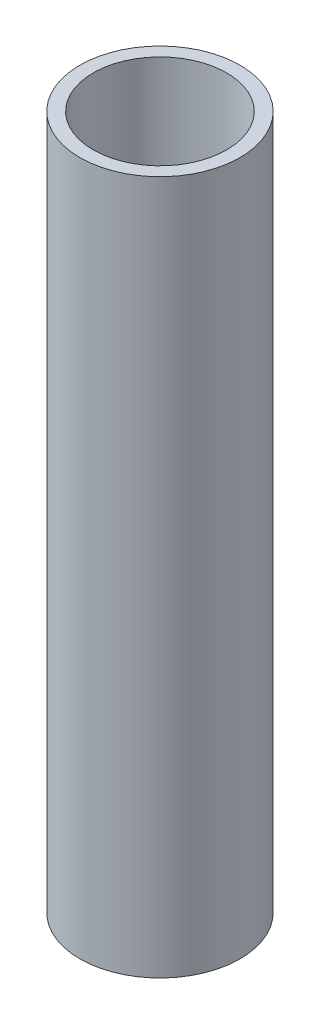
ISO-10303-21;
HEADER;
FILE_DESCRIPTION(('STEP AP214'),'2;1');
FILE_NAME('part.step','',(''),(''),'','','');
FILE_SCHEMA(('AUTOMOTIVE_DESIGN { 1 0 10303 214 1 1 1 1 }'));
ENDSEC;
DATA;
#1=APPLICATION_CONTEXT('core data for automotive mechanical design processes');
#2=APPLICATION_PROTOCOL_DEFINITION('international standard','automotive_design',2000,#1);
#3=PRODUCT_CONTEXT('',#1,'mechanical');
#4=PRODUCT('Part','Part','',(#3));
#5=PRODUCT_RELATED_PRODUCT_CATEGORY('part','',(#4));
#6=PRODUCT_DEFINITION_FORMATION('','',#4);
#7=PRODUCT_DEFINITION_CONTEXT('part definition',#1,'design');
#8=PRODUCT_DEFINITION('design','',#6,#7);
#9=PRODUCT_DEFINITION_SHAPE('','',#8);
#10=(LENGTH_UNIT() NAMED_UNIT(*) SI_UNIT(.MILLI.,.METRE.));
#11=(NAMED_UNIT(*) PLANE_ANGLE_UNIT() SI_UNIT($,.RADIAN.));
#12=(NAMED_UNIT(*) SI_UNIT($,.STERADIAN.) SOLID_ANGLE_UNIT());
#13=UNCERTAINTY_MEASURE_WITH_UNIT(LENGTH_MEASURE(1.E-05),#10,'distance_accuracy_value','');
#14=(GEOMETRIC_REPRESENTATION_CONTEXT(3) GLOBAL_UNCERTAINTY_ASSIGNED_CONTEXT((#13)) GLOBAL_UNIT_ASSIGNED_CONTEXT((#10,
#11,#12)) REPRESENTATION_CONTEXT('',''));
#15=CARTESIAN_POINT('',(0.,0.,0.));
#16=DIRECTION('',(0.,0.,1.));
#17=DIRECTION('',(1.,0.,0.));
#18=AXIS2_PLACEMENT_3D('',#15,#16,#17);
#19=CARTESIAN_POINT('',(0.,41.275,0.));
#20=DIRECTION('',(0.,1.,0.));
#21=DIRECTION('',(0.,0.,1.));
#22=AXIS2_PLACEMENT_3D('',#19,#20,#21);
#23=PLANE('',#22);
#24=CARTESIAN_POINT('',(0.,41.275,0.));
#25=DIRECTION('',(0.,1.,0.));
#26=DIRECTION('',(0.,0.,1.));
#27=AXIS2_PLACEMENT_3D('',#24,#25,#26);
#28=CIRCLE('',#27,4.7625);
#29=CARTESIAN_POINT('',(0.,41.275,4.7625));
#30=VERTEX_POINT('',#29);
#31=EDGE_CURVE('E10',#30,#30,#28,.T.);
#32=ORIENTED_EDGE('',*,*,#31,.T.);
#33=EDGE_LOOP('',(#32));
#34=FACE_BOUND('',#33,.T.);
#35=CARTESIAN_POINT('',(0.,41.275,0.));
#36=DIRECTION('',(0.,1.,0.));
#37=DIRECTION('',(0.,0.,1.));
#38=AXIS2_PLACEMENT_3D('',#35,#36,#37);
#39=CIRCLE('',#38,3.96875);
#40=CARTESIAN_POINT('',(0.,41.275,3.96875));
#41=VERTEX_POINT('',#40);
#42=EDGE_CURVE('E48',#41,#41,#39,.T.);
#43=ORIENTED_EDGE('',*,*,#42,.F.);
#44=EDGE_LOOP('',(#43));
#45=FACE_BOUND('',#44,.T.);
#46=ADVANCED_FACE('F37',(#34,#45),#23,.T.);
#47=CARTESIAN_POINT('',(0.,0.,0.));
#48=DIRECTION('',(0.,1.,0.));
#49=DIRECTION('',(0.,0.,1.));
#50=AXIS2_PLACEMENT_3D('',#47,#48,#49);
#51=PLANE('',#50);
#52=CARTESIAN_POINT('',(0.,0.,0.));
#53=DIRECTION('',(0.,1.,0.));
#54=DIRECTION('',(0.,0.,1.));
#55=AXIS2_PLACEMENT_3D('',#52,#53,#54);
#56=CIRCLE('',#55,4.7625);
#57=CARTESIAN_POINT('',(0.,0.,4.7625));
#58=VERTEX_POINT('',#57);
#59=EDGE_CURVE('E41',#58,#58,#56,.T.);
#60=ORIENTED_EDGE('',*,*,#59,.F.);
#61=EDGE_LOOP('',(#60));
#62=FACE_BOUND('',#61,.T.);
#63=CARTESIAN_POINT('',(0.,0.,0.));
#64=DIRECTION('',(0.,1.,0.));
#65=DIRECTION('',(0.,0.,1.));
#66=AXIS2_PLACEMENT_3D('',#63,#64,#65);
#67=CIRCLE('',#66,3.96875);
#68=CARTESIAN_POINT('',(0.,0.,3.96875));
#69=VERTEX_POINT('',#68);
#70=EDGE_CURVE('E50',#69,#69,#67,.T.);
#71=ORIENTED_EDGE('',*,*,#70,.T.);
#72=EDGE_LOOP('',(#71));
#73=FACE_BOUND('',#72,.T.);
#74=ADVANCED_FACE('F60',(#62,#73),#51,.F.);
#75=CARTESIAN_POINT('',(0.,41.275,0.));
#76=DIRECTION('',(0.,-1.,0.));
#77=DIRECTION('',(0.,0.,-1.));
#78=AXIS2_PLACEMENT_3D('',#75,#76,#77);
#79=CYLINDRICAL_SURFACE('',#78,4.7625);
#80=ORIENTED_EDGE('',*,*,#31,.F.);
#81=EDGE_LOOP('',(#80));
#82=FACE_BOUND('',#81,.T.);
#83=ORIENTED_EDGE('',*,*,#59,.T.);
#84=EDGE_LOOP('',(#83));
#85=FACE_BOUND('',#84,.T.);
#86=ADVANCED_FACE('F39',(#82,#85),#79,.T.);
#87=CARTESIAN_POINT('',(0.,41.275,0.));
#88=DIRECTION('',(0.,-1.,0.));
#89=DIRECTION('',(0.,0.,-1.));
#90=AXIS2_PLACEMENT_3D('',#87,#88,#89);
#91=CYLINDRICAL_SURFACE('',#90,3.96875);
#92=ORIENTED_EDGE('',*,*,#42,.T.);
#93=EDGE_LOOP('',(#92));
#94=FACE_BOUND('',#93,.T.);
#95=ORIENTED_EDGE('',*,*,#70,.F.);
#96=EDGE_LOOP('',(#95));
#97=FACE_BOUND('',#96,.T.);
#98=ADVANCED_FACE('F56',(#94,#97),#91,.F.);
#99=CLOSED_SHELL('',(#46,#74,#86,#98));
#100=MANIFOLD_SOLID_BREP('B2',#99);
#101=ADVANCED_BREP_SHAPE_REPRESENTATION('',(#18,#100),#14);
#102=SHAPE_DEFINITION_REPRESENTATION(#9,#101);
ENDSEC;
END-ISO-10303-21;
